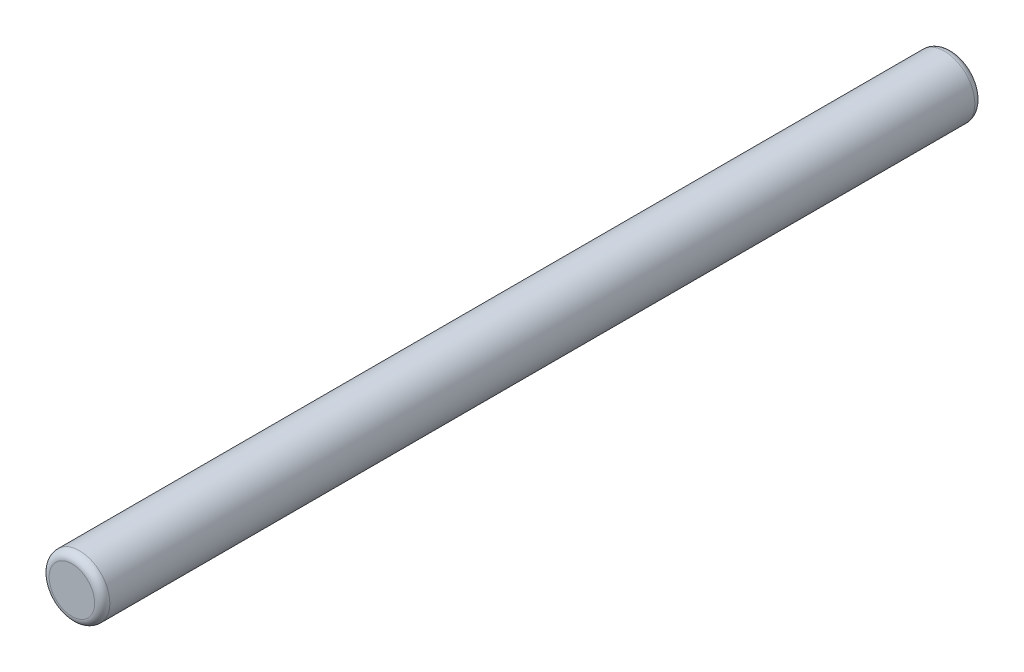
ISO-10303-21;
HEADER;
FILE_DESCRIPTION(('STEP AP214'),'2;1');
FILE_NAME('part.step','',(''),(''),'','','');
FILE_SCHEMA(('AUTOMOTIVE_DESIGN { 1 0 10303 214 1 1 1 1 }'));
ENDSEC;
DATA;
#1=APPLICATION_CONTEXT('core data for automotive mechanical design processes');
#2=APPLICATION_PROTOCOL_DEFINITION('international standard','automotive_design',2000,#1);
#3=PRODUCT_CONTEXT('',#1,'mechanical');
#4=PRODUCT('Part','Part','',(#3));
#5=PRODUCT_RELATED_PRODUCT_CATEGORY('part','',(#4));
#6=PRODUCT_DEFINITION_FORMATION('','',#4);
#7=PRODUCT_DEFINITION_CONTEXT('part definition',#1,'design');
#8=PRODUCT_DEFINITION('design','',#6,#7);
#9=PRODUCT_DEFINITION_SHAPE('','',#8);
#10=(LENGTH_UNIT() NAMED_UNIT(*) SI_UNIT(.MILLI.,.METRE.));
#11=(NAMED_UNIT(*) PLANE_ANGLE_UNIT() SI_UNIT($,.RADIAN.));
#12=(NAMED_UNIT(*) SI_UNIT($,.STERADIAN.) SOLID_ANGLE_UNIT());
#13=UNCERTAINTY_MEASURE_WITH_UNIT(LENGTH_MEASURE(1.E-05),#10,'distance_accuracy_value','');
#14=(GEOMETRIC_REPRESENTATION_CONTEXT(3) GLOBAL_UNCERTAINTY_ASSIGNED_CONTEXT((#13)) GLOBAL_UNIT_ASSIGNED_CONTEXT((#10,
#11,#12)) REPRESENTATION_CONTEXT('',''));
#15=CARTESIAN_POINT('',(0.,0.,0.));
#16=DIRECTION('',(0.,0.,1.));
#17=DIRECTION('',(1.,0.,0.));
#18=AXIS2_PLACEMENT_3D('',#15,#16,#17);
#19=CARTESIAN_POINT('',(-1.11022302462516E-13,0.,184.15));
#20=DIRECTION('',(0.,0.,-0.999999999999998));
#21=DIRECTION('',(-1.,0.,0.));
#22=AXIS2_PLACEMENT_3D('',#19,#20,#21);
#23=CYLINDRICAL_SURFACE('',#22,6.35);
#24=CARTESIAN_POINT('',(0.,0.,1.58749999999999));
#25=DIRECTION('',(0.,0.,0.999999999999998));
#26=DIRECTION('',(1.,0.,0.));
#27=AXIS2_PLACEMENT_3D('',#24,#25,#26);
#28=CIRCLE('',#27,6.35);
#29=CARTESIAN_POINT('',(-6.34999999999986,0.,1.58749999999996));
#30=VERTEX_POINT('',#29);
#31=EDGE_CURVE('E43',#30,#30,#28,.T.);
#32=CARTESIAN_POINT('',(-1.11022302462516E-13,0.,182.5625));
#33=DIRECTION('',(0.,0.,0.999999999999998));
#34=DIRECTION('',(1.,0.,0.));
#35=AXIS2_PLACEMENT_3D('',#32,#33,#34);
#36=CIRCLE('',#35,6.35);
#37=CARTESIAN_POINT('',(-6.35000000000011,0.,182.5625));
#38=VERTEX_POINT('',#37);
#39=EDGE_CURVE('E47',#38,#38,#36,.F.);
#40=CARTESIAN_POINT('',(-6.34999999999986,0.,1.58749999999996));
#41=CARTESIAN_POINT('',(-6.34999999999986,0.,3.47265624999996));
#42=CARTESIAN_POINT('',(-6.34999999999986,0.,5.35781249999995));
#43=CARTESIAN_POINT('',(-6.34999999999987,0.,9.12812499999994));
#44=CARTESIAN_POINT('',(-6.34999999999987,0.,11.0132812499999));
#45=CARTESIAN_POINT('',(-6.34999999999988,0.,14.7835937499999));
#46=CARTESIAN_POINT('',(-6.34999999999988,0.,16.6687499999999));
#47=CARTESIAN_POINT('',(-6.34999999999988,0.,20.4390624999999));
#48=CARTESIAN_POINT('',(-6.34999999999989,0.,22.3242187499999));
#49=CARTESIAN_POINT('',(-6.34999999999989,0.,26.0945312499999));
#50=CARTESIAN_POINT('',(-6.34999999999989,0.,27.9796874999999));
#51=CARTESIAN_POINT('',(-6.3499999999999,0.,31.7499999999999));
#52=CARTESIAN_POINT('',(-6.3499999999999,0.,33.6351562499999));
#53=CARTESIAN_POINT('',(-6.34999999999991,0.,37.4054687499999));
#54=CARTESIAN_POINT('',(-6.34999999999991,0.,39.2906249999999));
#55=CARTESIAN_POINT('',(-6.34999999999992,0.,43.0609374999998));
#56=CARTESIAN_POINT('',(-6.34999999999992,0.,44.9460937499999));
#57=CARTESIAN_POINT('',(-6.34999999999992,0.,48.7164062499998));
#58=CARTESIAN_POINT('',(-6.34999999999993,0.,50.6015624999998));
#59=CARTESIAN_POINT('',(-6.34999999999993,0.,54.3718749999998));
#60=CARTESIAN_POINT('',(-6.34999999999993,0.,56.2570312499998));
#61=CARTESIAN_POINT('',(-6.34999999999994,0.,60.0273437499998));
#62=CARTESIAN_POINT('',(-6.34999999999994,0.,61.9124999999998));
#63=CARTESIAN_POINT('',(-6.34999999999995,0.,65.6828124999998));
#64=CARTESIAN_POINT('',(-6.34999999999995,0.,67.5679687499998));
#65=CARTESIAN_POINT('',(-6.34999999999995,0.,71.3382812499998));
#66=CARTESIAN_POINT('',(-6.34999999999996,0.,73.2234374999998));
#67=CARTESIAN_POINT('',(-6.34999999999996,0.,76.9937499999998));
#68=CARTESIAN_POINT('',(-6.34999999999997,0.,78.8789062499998));
#69=CARTESIAN_POINT('',(-6.34999999999997,0.,82.6492187499997));
#70=CARTESIAN_POINT('',(-6.34999999999997,0.,84.5343749999998));
#71=CARTESIAN_POINT('',(-6.34999999999998,0.,88.3046874999997));
#72=CARTESIAN_POINT('',(-6.34999999999998,0.,90.1898437499998));
#73=CARTESIAN_POINT('',(-6.34999999999999,0.,93.9601562499997));
#74=CARTESIAN_POINT('',(-6.34999999999999,0.,95.8453124999997));
#75=CARTESIAN_POINT('',(-6.34999999999999,0.,99.6156249999997));
#76=CARTESIAN_POINT('',(-6.35,0.,101.50078125));
#77=CARTESIAN_POINT('',(-6.35,0.,105.27109375));
#78=CARTESIAN_POINT('',(-6.35,0.,107.15625));
#79=CARTESIAN_POINT('',(-6.35000000000001,0.,110.9265625));
#80=CARTESIAN_POINT('',(-6.35000000000001,0.,112.81171875));
#81=CARTESIAN_POINT('',(-6.35000000000002,0.,116.58203125));
#82=CARTESIAN_POINT('',(-6.35000000000002,0.,118.4671875));
#83=CARTESIAN_POINT('',(-6.35000000000003,0.,122.2375));
#84=CARTESIAN_POINT('',(-6.35000000000003,0.,124.12265625));
#85=CARTESIAN_POINT('',(-6.35000000000003,0.,127.89296875));
#86=CARTESIAN_POINT('',(-6.35000000000004,0.,129.778125));
#87=CARTESIAN_POINT('',(-6.35000000000004,0.,133.5484375));
#88=CARTESIAN_POINT('',(-6.35000000000004,0.,135.43359375));
#89=CARTESIAN_POINT('',(-6.35000000000005,0.,139.20390625));
#90=CARTESIAN_POINT('',(-6.35000000000005,0.,141.0890625));
#91=CARTESIAN_POINT('',(-6.35000000000006,0.,144.859375));
#92=CARTESIAN_POINT('',(-6.35000000000006,0.,146.74453125));
#93=CARTESIAN_POINT('',(-6.35000000000007,0.,150.51484375));
#94=CARTESIAN_POINT('',(-6.35000000000007,0.,152.4));
#95=CARTESIAN_POINT('',(-6.35000000000007,0.,156.1703125));
#96=CARTESIAN_POINT('',(-6.35000000000008,0.,158.05546875));
#97=CARTESIAN_POINT('',(-6.35000000000008,0.,161.82578125));
#98=CARTESIAN_POINT('',(-6.35000000000008,0.,163.7109375));
#99=CARTESIAN_POINT('',(-6.35000000000009,0.,167.48125));
#100=CARTESIAN_POINT('',(-6.35000000000009,0.,169.36640625));
#101=CARTESIAN_POINT('',(-6.3500000000001,0.,173.13671875));
#102=CARTESIAN_POINT('',(-6.3500000000001,0.,175.021875));
#103=CARTESIAN_POINT('',(-6.35000000000011,0.,178.792187499999));
#104=CARTESIAN_POINT('',(-6.35000000000011,0.,180.67734375));
#105=CARTESIAN_POINT('',(-6.35000000000011,0.,182.5625));
#106=B_SPLINE_CURVE_WITH_KNOTS('',3,(#40,#41,#42,#43,#44,#45,#46,#47,#48,#49,#50,#51,#52,#53,
#54,#55,#56,#57,#58,#59,#60,#61,#62,#63,#64,#65,#66,#67,#68,#69,#70,#71,#72,#73,#74,#75,#76,#77,
#78,#79,#80,#81,#82,#83,#84,#85,#86,#87,#88,#89,#90,#91,#92,#93,#94,#95,#96,#97,#98,#99,#100,
#101,#102,#103,#104,#105),.UNSPECIFIED.,.F.,.F.,(4,2,2,2,2,2,2,2,2,2,2,2,2,2,2,2,2,2,2,2,2,2,2,
2,2,2,2,2,2,2,2,2,4),(0.,5.65546874999998,11.3109375,16.96640625,22.6218749999999,
28.2773437499999,33.9328124999999,39.5882812499999,45.2437499999999,50.8992187499999,
56.5546874999999,62.2101562499998,67.8656249999998,73.5210937499998,79.1765624999998,
84.8320312499998,90.4874999999998,96.1429687499998,101.7984375,107.45390625,113.109375,
118.76484375,124.4203125,130.07578125,135.73125,141.38671875,147.0421875,152.69765625,
158.353125,164.00859375,169.6640625,175.31953125,180.975),.UNSPECIFIED.);
#107=EDGE_CURVE('BSEAM32',#30,#38,#106,.T.);
#108=ORIENTED_EDGE('',*,*,#31,.T.);
#109=ORIENTED_EDGE('',*,*,#39,.T.);
#110=ORIENTED_EDGE('',*,*,#107,.T.);
#111=ORIENTED_EDGE('',*,*,#107,.F.);
#112=EDGE_LOOP('',(#108,#110,#109,#111));
#113=FACE_BOUND('',#112,.T.);
#114=ADVANCED_FACE('F32',(#113),#23,.T.);
#115=CARTESIAN_POINT('',(-1.11022302462516E-13,0.,184.15));
#116=DIRECTION('',(0.,0.,0.999999999999998));
#117=DIRECTION('',(1.,0.,0.));
#118=AXIS2_PLACEMENT_3D('',#115,#116,#117);
#119=PLANE('',#118);
#120=CARTESIAN_POINT('',(-1.11022302462516E-13,0.,184.15));
#121=DIRECTION('',(0.,0.,0.999999999999998));
#122=DIRECTION('',(1.,0.,0.));
#123=AXIS2_PLACEMENT_3D('',#120,#121,#122);
#124=CIRCLE('',#123,4.7625);
#125=CARTESIAN_POINT('',(4.76249999999989,0.,184.15));
#126=VERTEX_POINT('',#125);
#127=EDGE_CURVE('E10',#126,#126,#124,.T.);
#128=ORIENTED_EDGE('',*,*,#127,.T.);
#129=EDGE_LOOP('',(#128));
#130=FACE_BOUND('',#129,.T.);
#131=ADVANCED_FACE('F63',(#130),#119,.T.);
#132=CARTESIAN_POINT('',(0.,0.,0.));
#133=DIRECTION('',(0.,0.,0.999999999999998));
#134=DIRECTION('',(1.,0.,0.));
#135=AXIS2_PLACEMENT_3D('',#132,#133,#134);
#136=PLANE('',#135);
#137=CARTESIAN_POINT('',(0.,0.,0.));
#138=DIRECTION('',(0.,0.,0.999999999999998));
#139=DIRECTION('',(1.,0.,0.));
#140=AXIS2_PLACEMENT_3D('',#137,#138,#139);
#141=CIRCLE('',#140,4.7625);
#142=CARTESIAN_POINT('',(4.7625,0.,0.));
#143=VERTEX_POINT('',#142);
#144=EDGE_CURVE('E39',#143,#143,#141,.F.);
#145=ORIENTED_EDGE('',*,*,#144,.T.);
#146=EDGE_LOOP('',(#145));
#147=FACE_BOUND('',#146,.T.);
#148=ADVANCED_FACE('F60',(#147),#136,.F.);
#149=CARTESIAN_POINT('',(0.,0.,1.58749999999999));
#150=DIRECTION('',(0.,0.,0.999999999999998));
#151=DIRECTION('',(1.,0.,0.));
#152=AXIS2_PLACEMENT_3D('',#149,#150,#151);
#153=TOROIDAL_SURFACE('',#152,4.7625,1.5875);
#154=ORIENTED_EDGE('',*,*,#144,.F.);
#155=EDGE_LOOP('',(#154));
#156=FACE_BOUND('',#155,.T.);
#157=ORIENTED_EDGE('',*,*,#31,.F.);
#158=EDGE_LOOP('',(#157));
#159=FACE_BOUND('',#158,.T.);
#160=ADVANCED_FACE('F56',(#156,#159),#153,.T.);
#161=CARTESIAN_POINT('',(-1.11022302462516E-13,0.,182.5625));
#162=DIRECTION('',(0.,0.,0.999999999999998));
#163=DIRECTION('',(1.,0.,0.));
#164=AXIS2_PLACEMENT_3D('',#161,#162,#163);
#165=TOROIDAL_SURFACE('',#164,4.7625,1.5875);
#166=ORIENTED_EDGE('',*,*,#39,.F.);
#167=EDGE_LOOP('',(#166));
#168=FACE_BOUND('',#167,.T.);
#169=ORIENTED_EDGE('',*,*,#127,.F.);
#170=EDGE_LOOP('',(#169));
#171=FACE_BOUND('',#170,.T.);
#172=ADVANCED_FACE('F34',(#168,#171),#165,.T.);
#173=CLOSED_SHELL('',(#114,#131,#148,#160,#172));
#174=MANIFOLD_SOLID_BREP('B2',#173);
#175=ADVANCED_BREP_SHAPE_REPRESENTATION('',(#18,#174),#14);
#176=SHAPE_DEFINITION_REPRESENTATION(#9,#175);
ENDSEC;
END-ISO-10303-21;
